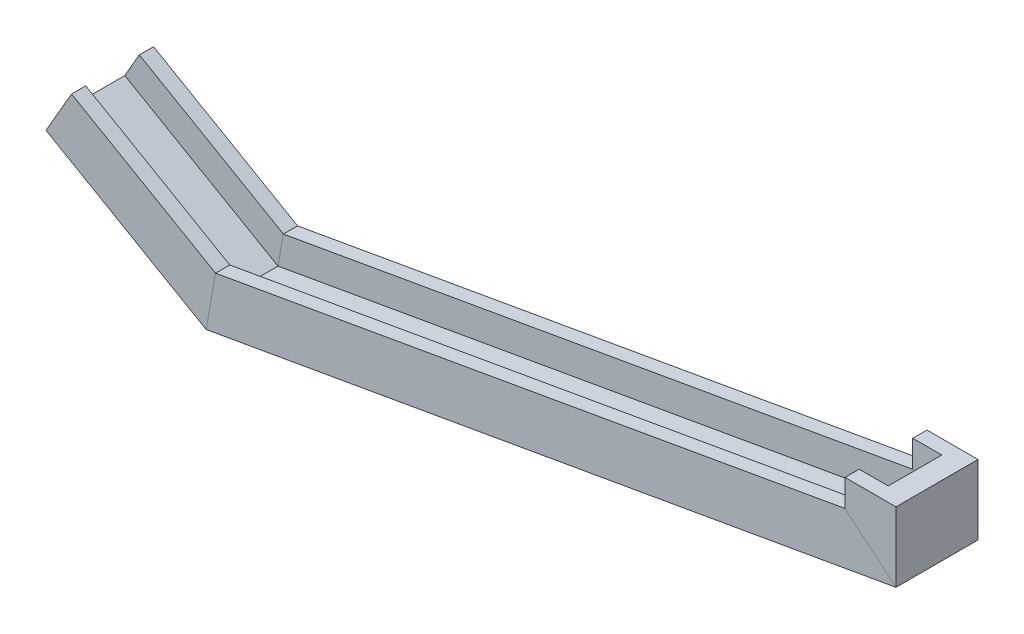
ISO-10303-21;
HEADER;
FILE_DESCRIPTION(('STEP AP214'),'2;1');
FILE_NAME('part.step','',(''),(''),'','','');
FILE_SCHEMA(('AUTOMOTIVE_DESIGN { 1 0 10303 214 1 1 1 1 }'));
ENDSEC;
DATA;
#1=APPLICATION_CONTEXT('core data for automotive mechanical design processes');
#2=APPLICATION_PROTOCOL_DEFINITION('international standard','automotive_design',2000,#1);
#3=PRODUCT_CONTEXT('',#1,'mechanical');
#4=PRODUCT('Part','Part','',(#3));
#5=PRODUCT_RELATED_PRODUCT_CATEGORY('part','',(#4));
#6=PRODUCT_DEFINITION_FORMATION('','',#4);
#7=PRODUCT_DEFINITION_CONTEXT('part definition',#1,'design');
#8=PRODUCT_DEFINITION('design','',#6,#7);
#9=PRODUCT_DEFINITION_SHAPE('','',#8);
#10=(LENGTH_UNIT() NAMED_UNIT(*) SI_UNIT(.MILLI.,.METRE.));
#11=(NAMED_UNIT(*) PLANE_ANGLE_UNIT() SI_UNIT($,.RADIAN.));
#12=(NAMED_UNIT(*) SI_UNIT($,.STERADIAN.) SOLID_ANGLE_UNIT());
#13=UNCERTAINTY_MEASURE_WITH_UNIT(LENGTH_MEASURE(1.E-05),#10,'distance_accuracy_value','');
#14=(GEOMETRIC_REPRESENTATION_CONTEXT(3) GLOBAL_UNCERTAINTY_ASSIGNED_CONTEXT((#13)) GLOBAL_UNIT_ASSIGNED_CONTEXT((#10,
#11,#12)) REPRESENTATION_CONTEXT('',''));
#15=CARTESIAN_POINT('',(0.,0.,0.));
#16=DIRECTION('',(0.,0.,1.));
#17=DIRECTION('',(1.,0.,0.));
#18=AXIS2_PLACEMENT_3D('',#15,#16,#17);
#19=CARTESIAN_POINT('',(-188.040030525231,-31.7909185882383,0.));
#20=DIRECTION('',(0.866025403784436,-0.500000000000005,0.));
#21=DIRECTION('',(0.,0.,1.));
#22=AXIS2_PLACEMENT_3D('',#19,#20,#21);
#23=PLANE('',#22);
#24=DIRECTION('',(0.500000000000005,0.866025403784436,0.));
#25=VECTOR('',#24,1.);
#26=CARTESIAN_POINT('',(-175.873309957385,-10.7175404032353,-24.3031703208653));
#27=LINE('',#26,#25);
#28=CARTESIAN_POINT('',(-180.873309957385,-19.3777944410797,-24.3031703208653));
#29=VERTEX_POINT('',#28);
#30=CARTESIAN_POINT('',(-175.873309957385,-10.7175404032353,-24.3031703208653));
#31=VERTEX_POINT('',#30);
#32=EDGE_CURVE('E127',#29,#31,#27,.T.);
#33=ORIENTED_EDGE('',*,*,#32,.F.);
#34=DIRECTION('',(0.,0.,-1.));
#35=VECTOR('',#34,1.);
#36=CARTESIAN_POINT('',(-180.873309957385,-19.3777944410797,-8.23317032086531));
#37=LINE('',#36,#35);
#38=CARTESIAN_POINT('',(-180.873309957385,-19.3777944410797,-8.23317032086531));
#39=VERTEX_POINT('',#38);
#40=EDGE_CURVE('E181',#39,#29,#37,.T.);
#41=ORIENTED_EDGE('',*,*,#40,.F.);
#42=DIRECTION('',(-0.500000000000005,-0.866025403784436,0.));
#43=VECTOR('',#42,1.);
#44=CARTESIAN_POINT('',(-175.873309957385,-10.7175404032353,-8.23317032086531));
#45=LINE('',#44,#43);
#46=CARTESIAN_POINT('',(-175.873309957385,-10.7175404032353,-8.23317032086531));
#47=VERTEX_POINT('',#46);
#48=EDGE_CURVE('E178',#47,#39,#45,.T.);
#49=ORIENTED_EDGE('',*,*,#48,.F.);
#50=DIRECTION('',(0.,0.,1.));
#51=VECTOR('',#50,1.);
#52=CARTESIAN_POINT('',(-175.873309957385,-10.7175404032353,-11.0181703208653));
#53=LINE('',#52,#51);
#54=CARTESIAN_POINT('',(-175.873309957385,-10.7175404032353,-11.0181703208653));
#55=VERTEX_POINT('',#54);
#56=EDGE_CURVE('E175',#55,#47,#53,.T.);
#57=ORIENTED_EDGE('',*,*,#56,.F.);
#58=DIRECTION('',(0.500000000000005,0.866025403784436,0.));
#59=VECTOR('',#58,1.);
#60=CARTESIAN_POINT('',(-178.71986344873,-15.6479156767077,-11.0181703208653));
#61=LINE('',#60,#59);
#62=CARTESIAN_POINT('',(-178.71986344873,-15.6479156767077,-11.0181703208653));
#63=VERTEX_POINT('',#62);
#64=EDGE_CURVE('E172',#63,#55,#61,.T.);
#65=ORIENTED_EDGE('',*,*,#64,.F.);
#66=DIRECTION('',(0.,0.,1.));
#67=VECTOR('',#66,1.);
#68=CARTESIAN_POINT('',(-178.71986344873,-15.6479156767077,-21.5181703208653));
#69=LINE('',#68,#67);
#70=CARTESIAN_POINT('',(-178.71986344873,-15.6479156767077,-21.5181703208653));
#71=VERTEX_POINT('',#70);
#72=EDGE_CURVE('E130',#71,#63,#69,.T.);
#73=ORIENTED_EDGE('',*,*,#72,.F.);
#74=DIRECTION('',(-0.500000000000005,-0.866025403784436,0.));
#75=VECTOR('',#74,1.);
#76=CARTESIAN_POINT('',(-175.873309957385,-10.7175404032353,-21.5181703208653));
#77=LINE('',#76,#75);
#78=CARTESIAN_POINT('',(-175.873309957385,-10.7175404032353,-21.5181703208653));
#79=VERTEX_POINT('',#78);
#80=EDGE_CURVE('E111',#79,#71,#77,.T.);
#81=ORIENTED_EDGE('',*,*,#80,.F.);
#82=DIRECTION('',(0.,0.,1.));
#83=VECTOR('',#82,1.);
#84=CARTESIAN_POINT('',(-175.873309957385,-10.7175404032353,-21.5181703208653));
#85=LINE('',#84,#83);
#86=EDGE_CURVE('E118',#31,#79,#85,.T.);
#87=ORIENTED_EDGE('',*,*,#86,.F.);
#88=EDGE_LOOP('',(#33,#41,#49,#57,#65,#73,#81,#87));
#89=FACE_BOUND('',#88,.T.);
#90=ADVANCED_FACE('F39',(#89),#23,.F.);
#91=CARTESIAN_POINT('',(0.,0.,0.));
#92=DIRECTION('',(0.,1.,0.));
#93=DIRECTION('',(0.,0.,1.));
#94=AXIS2_PLACEMENT_3D('',#91,#92,#93);
#95=PLANE('',#94);
#96=DIRECTION('',(-1.,0.,0.));
#97=VECTOR('',#96,1.);
#98=CARTESIAN_POINT('',(-24.3334411356926,0.,-24.3031703208653));
#99=LINE('',#98,#97);
#100=CARTESIAN_POINT('',(-14.3334411356926,0.,-24.3031703208653));
#101=VERTEX_POINT('',#100);
#102=CARTESIAN_POINT('',(-24.3334411356926,0.,-24.3031703208653));
#103=VERTEX_POINT('',#102);
#104=EDGE_CURVE('E252',#101,#103,#99,.T.);
#105=ORIENTED_EDGE('',*,*,#104,.T.);
#106=DIRECTION('',(0.,0.,1.));
#107=VECTOR('',#106,1.);
#108=CARTESIAN_POINT('',(-24.3334411356926,0.,-21.5181703208653));
#109=LINE('',#108,#107);
#110=CARTESIAN_POINT('',(-24.3334411356926,0.,-21.5181703208653));
#111=VERTEX_POINT('',#110);
#112=EDGE_CURVE('E247',#103,#111,#109,.T.);
#113=ORIENTED_EDGE('',*,*,#112,.T.);
#114=DIRECTION('',(1.,0.,0.));
#115=VECTOR('',#114,1.);
#116=CARTESIAN_POINT('',(-24.3334411356926,0.,-21.5181703208653));
#117=LINE('',#116,#115);
#118=CARTESIAN_POINT('',(-18.6403341530022,0.,-21.5181703208653));
#119=VERTEX_POINT('',#118);
#120=EDGE_CURVE('E240',#111,#119,#117,.T.);
#121=ORIENTED_EDGE('',*,*,#120,.T.);
#122=DIRECTION('',(0.,0.,1.));
#123=VECTOR('',#122,1.);
#124=CARTESIAN_POINT('',(-18.6403341530022,0.,-21.5181703208653));
#125=LINE('',#124,#123);
#126=CARTESIAN_POINT('',(-18.6403341530022,0.,-11.0181703208653));
#127=VERTEX_POINT('',#126);
#128=EDGE_CURVE('E292',#119,#127,#125,.T.);
#129=ORIENTED_EDGE('',*,*,#128,.T.);
#130=DIRECTION('',(-1.,0.,0.));
#131=VECTOR('',#130,1.);
#132=CARTESIAN_POINT('',(-18.6403341530022,0.,-11.0181703208653));
#133=LINE('',#132,#131);
#134=CARTESIAN_POINT('',(-24.3334411356926,0.,-11.0181703208653));
#135=VERTEX_POINT('',#134);
#136=EDGE_CURVE('E284',#127,#135,#133,.T.);
#137=ORIENTED_EDGE('',*,*,#136,.T.);
#138=DIRECTION('',(0.,0.,1.));
#139=VECTOR('',#138,1.);
#140=CARTESIAN_POINT('',(-24.3334411356926,0.,-11.0181703208653));
#141=LINE('',#140,#139);
#142=CARTESIAN_POINT('',(-24.3334411356926,0.,-8.23317032086531));
#143=VERTEX_POINT('',#142);
#144=EDGE_CURVE('E276',#135,#143,#141,.T.);
#145=ORIENTED_EDGE('',*,*,#144,.T.);
#146=DIRECTION('',(1.,0.,0.));
#147=VECTOR('',#146,1.);
#148=CARTESIAN_POINT('',(-24.3334411356926,0.,-8.23317032086531));
#149=LINE('',#148,#147);
#150=CARTESIAN_POINT('',(-14.3334411356926,0.,-8.23317032086531));
#151=VERTEX_POINT('',#150);
#152=EDGE_CURVE('E268',#143,#151,#149,.T.);
#153=ORIENTED_EDGE('',*,*,#152,.T.);
#154=DIRECTION('',(0.,0.,-1.));
#155=VECTOR('',#154,1.);
#156=CARTESIAN_POINT('',(-14.3334411356926,0.,-8.23317032086531));
#157=LINE('',#156,#155);
#158=EDGE_CURVE('E260',#151,#101,#157,.T.);
#159=ORIENTED_EDGE('',*,*,#158,.T.);
#160=EDGE_LOOP('',(#105,#113,#121,#129,#137,#145,#153,#159));
#161=FACE_BOUND('',#160,.T.);
#162=ADVANCED_FACE('F388',(#161),#95,.T.);
#163=CARTESIAN_POINT('',(-144.275002717369,-28.9608315941949,-21.5181703208653));
#164=DIRECTION('',(0.,0.,-1.));
#165=DIRECTION('',(-1.,0.,0.));
#166=AXIS2_PLACEMENT_3D('',#163,#164,#165);
#167=PLANE('',#166);
#168=DIRECTION('',(0.173648177666935,0.984807753012207,0.));
#169=VECTOR('',#168,1.);
#170=CARTESIAN_POINT('',(-139.688124452556,18.14868532677,-21.5181703208653));
#171=LINE('',#170,#169);
#172=CARTESIAN_POINT('',(-148.703151296713,-32.9780725178624,-21.5181703208653));
#173=VERTEX_POINT('',#172);
#174=CARTESIAN_POINT('',(-147.651107648674,-27.0116365032938,-21.5181703208653));
#175=VERTEX_POINT('',#174);
#176=EDGE_CURVE('E135',#173,#175,#171,.T.);
#177=ORIENTED_EDGE('',*,*,#176,.T.);
#178=DIRECTION('',(-0.866025403784436,0.500000000000005,0.));
#179=VECTOR('',#178,1.);
#180=CARTESIAN_POINT('',(-144.275002717369,-28.9608315941949,-21.5181703208653));
#181=LINE('',#180,#179);
#182=EDGE_CURVE('E42',#175,#79,#181,.T.);
#183=ORIENTED_EDGE('',*,*,#182,.T.);
#184=ORIENTED_EDGE('',*,*,#80,.T.);
#185=DIRECTION('',(-0.866025403784436,0.500000000000005,0.));
#186=VECTOR('',#185,1.);
#187=CARTESIAN_POINT('',(-147.121556208715,-33.8912068676673,-21.5181703208653));
#188=LINE('',#187,#186);
#189=EDGE_CURVE('E139',#173,#71,#188,.T.);
#190=ORIENTED_EDGE('',*,*,#189,.F.);
#191=EDGE_LOOP('',(#177,#183,#184,#190));
#192=FACE_BOUND('',#191,.T.);
#193=ADVANCED_FACE('F134',(#192),#167,.F.);
#194=CARTESIAN_POINT('',(-147.121556208715,-33.8912068676673,-21.5181703208653));
#195=DIRECTION('',(-0.500000000000005,-0.866025403784436,0.));
#196=DIRECTION('',(0.866025403784436,-0.500000000000005,0.));
#197=AXIS2_PLACEMENT_3D('',#194,#195,#196);
#198=PLANE('',#197);
#199=DIRECTION('',(0.,0.,-1.));
#200=VECTOR('',#199,1.);
#201=CARTESIAN_POINT('',(-148.703151296713,-32.9780725178624,-21.5181703208653));
#202=LINE('',#201,#200);
#203=CARTESIAN_POINT('',(-148.703151296713,-32.9780725178624,-11.0181703208653));
#204=VERTEX_POINT('',#203);
#205=EDGE_CURVE('E237',#204,#173,#202,.T.);
#206=ORIENTED_EDGE('',*,*,#205,.T.);
#207=ORIENTED_EDGE('',*,*,#189,.T.);
#208=ORIENTED_EDGE('',*,*,#72,.T.);
#209=DIRECTION('',(-0.866025403784436,0.500000000000005,0.));
#210=VECTOR('',#209,1.);
#211=CARTESIAN_POINT('',(-147.121556208715,-33.8912068676673,-11.0181703208653));
#212=LINE('',#211,#210);
#213=EDGE_CURVE('E145',#204,#63,#212,.T.);
#214=ORIENTED_EDGE('',*,*,#213,.F.);
#215=EDGE_LOOP('',(#206,#207,#208,#214));
#216=FACE_BOUND('',#215,.T.);
#217=ADVANCED_FACE('F400',(#216),#198,.F.);
#218=CARTESIAN_POINT('',(-147.121556208715,-33.8912068676673,-11.0181703208653));
#219=DIRECTION('',(0.,0.,1.));
#220=DIRECTION('',(1.,0.,0.));
#221=AXIS2_PLACEMENT_3D('',#218,#219,#220);
#222=PLANE('',#221);
#223=DIRECTION('',(-0.173648177666935,-0.984807753012207,0.));
#224=VECTOR('',#223,1.);
#225=CARTESIAN_POINT('',(-140.617102371825,12.8801897423931,-11.0181703208653));
#226=LINE('',#225,#224);
#227=CARTESIAN_POINT('',(-147.651107648674,-27.0116365032938,-11.0181703208653));
#228=VERTEX_POINT('',#227);
#229=EDGE_CURVE('E233',#228,#204,#226,.T.);
#230=ORIENTED_EDGE('',*,*,#229,.T.);
#231=ORIENTED_EDGE('',*,*,#213,.T.);
#232=ORIENTED_EDGE('',*,*,#64,.T.);
#233=DIRECTION('',(-0.866025403784436,0.500000000000005,0.));
#234=VECTOR('',#233,1.);
#235=CARTESIAN_POINT('',(-144.275002717369,-28.9608315941949,-11.0181703208653));
#236=LINE('',#235,#234);
#237=EDGE_CURVE('E150',#228,#55,#236,.T.);
#238=ORIENTED_EDGE('',*,*,#237,.F.);
#239=EDGE_LOOP('',(#230,#231,#232,#238));
#240=FACE_BOUND('',#239,.T.);
#241=ADVANCED_FACE('F403',(#240),#222,.F.);
#242=CARTESIAN_POINT('',(-144.275002717369,-28.9608315941949,-11.0181703208653));
#243=DIRECTION('',(-0.500000000000005,-0.866025403784436,0.));
#244=DIRECTION('',(0.866025403784436,-0.500000000000005,0.));
#245=AXIS2_PLACEMENT_3D('',#242,#243,#244);
#246=PLANE('',#245);
#247=DIRECTION('',(0.,0.,-1.));
#248=VECTOR('',#247,1.);
#249=CARTESIAN_POINT('',(-147.651107648674,-27.0116365032938,-11.0181703208653));
#250=LINE('',#249,#248);
#251=CARTESIAN_POINT('',(-147.651107648674,-27.0116365032938,-8.23317032086531));
#252=VERTEX_POINT('',#251);
#253=EDGE_CURVE('E229',#252,#228,#250,.T.);
#254=ORIENTED_EDGE('',*,*,#253,.T.);
#255=ORIENTED_EDGE('',*,*,#237,.T.);
#256=ORIENTED_EDGE('',*,*,#56,.T.);
#257=DIRECTION('',(-0.866025403784436,0.500000000000005,0.));
#258=VECTOR('',#257,1.);
#259=CARTESIAN_POINT('',(-144.275002717369,-28.9608315941949,-8.23317032086531));
#260=LINE('',#259,#258);
#261=EDGE_CURVE('E156',#252,#47,#260,.T.);
#262=ORIENTED_EDGE('',*,*,#261,.F.);
#263=EDGE_LOOP('',(#254,#255,#256,#262));
#264=FACE_BOUND('',#263,.T.);
#265=ADVANCED_FACE('F406',(#264),#246,.F.);
#266=CARTESIAN_POINT('',(-144.275002717369,-28.9608315941949,-8.23317032086531));
#267=DIRECTION('',(0.,0.,-1.));
#268=DIRECTION('',(-1.,0.,0.));
#269=AXIS2_PLACEMENT_3D('',#266,#267,#268);
#270=PLANE('',#269);
#271=DIRECTION('',(0.173648177666935,0.984807753012207,0.));
#272=VECTOR('',#271,1.);
#273=CARTESIAN_POINT('',(-139.688124452556,18.14868532677,-8.23317032086531));
#274=LINE('',#273,#272);
#275=CARTESIAN_POINT('',(-149.499032957715,-37.4917417124692,-8.23317032086531));
#276=VERTEX_POINT('',#275);
#277=EDGE_CURVE('E225',#276,#252,#274,.T.);
#278=ORIENTED_EDGE('',*,*,#277,.T.);
#279=ORIENTED_EDGE('',*,*,#261,.T.);
#280=ORIENTED_EDGE('',*,*,#48,.T.);
#281=DIRECTION('',(-0.866025403784436,0.500000000000005,0.));
#282=VECTOR('',#281,1.);
#283=CARTESIAN_POINT('',(-149.275002717369,-37.6210856320393,-8.23317032086531));
#284=LINE('',#283,#282);
#285=EDGE_CURVE('E160',#276,#39,#284,.T.);
#286=ORIENTED_EDGE('',*,*,#285,.F.);
#287=EDGE_LOOP('',(#278,#279,#280,#286));
#288=FACE_BOUND('',#287,.T.);
#289=ADVANCED_FACE('F410',(#288),#270,.F.);
#290=CARTESIAN_POINT('',(-149.275002717369,-37.6210856320393,-8.23317032086531));
#291=DIRECTION('',(0.500000000000005,0.866025403784436,0.));
#292=DIRECTION('',(-0.866025403784436,0.500000000000005,0.));
#293=AXIS2_PLACEMENT_3D('',#290,#291,#292);
#294=PLANE('',#293);
#295=DIRECTION('',(0.,0.,1.));
#296=VECTOR('',#295,1.);
#297=CARTESIAN_POINT('',(-149.499032957715,-37.4917417124692,-8.23317032086531));
#298=LINE('',#297,#296);
#299=CARTESIAN_POINT('',(-149.499032957715,-37.4917417124692,-24.3031703208653));
#300=VERTEX_POINT('',#299);
#301=EDGE_CURVE('E221',#300,#276,#298,.T.);
#302=ORIENTED_EDGE('',*,*,#301,.T.);
#303=ORIENTED_EDGE('',*,*,#285,.T.);
#304=ORIENTED_EDGE('',*,*,#40,.T.);
#305=DIRECTION('',(-0.866025403784436,0.500000000000005,0.));
#306=VECTOR('',#305,1.);
#307=CARTESIAN_POINT('',(-149.275002717369,-37.6210856320393,-24.3031703208653));
#308=LINE('',#307,#306);
#309=EDGE_CURVE('E164',#300,#29,#308,.T.);
#310=ORIENTED_EDGE('',*,*,#309,.F.);
#311=EDGE_LOOP('',(#302,#303,#304,#310));
#312=FACE_BOUND('',#311,.T.);
#313=ADVANCED_FACE('F414',(#312),#294,.F.);
#314=CARTESIAN_POINT('',(-144.275002717369,-28.9608315941949,-24.3031703208653));
#315=DIRECTION('',(0.,0.,1.));
#316=DIRECTION('',(1.,0.,0.));
#317=AXIS2_PLACEMENT_3D('',#314,#315,#316);
#318=PLANE('',#317);
#319=DIRECTION('',(-0.173648177666935,-0.984807753012207,0.));
#320=VECTOR('',#319,1.);
#321=CARTESIAN_POINT('',(-139.688124452556,18.14868532677,-24.3031703208653));
#322=LINE('',#321,#320);
#323=CARTESIAN_POINT('',(-147.651107648674,-27.0116365032938,-24.3031703208653));
#324=VERTEX_POINT('',#323);
#325=EDGE_CURVE('E217',#324,#300,#322,.T.);
#326=ORIENTED_EDGE('',*,*,#325,.T.);
#327=ORIENTED_EDGE('',*,*,#309,.T.);
#328=ORIENTED_EDGE('',*,*,#32,.T.);
#329=DIRECTION('',(-0.866025403784436,0.500000000000005,0.));
#330=VECTOR('',#329,1.);
#331=CARTESIAN_POINT('',(-144.275002717369,-28.9608315941949,-24.3031703208653));
#332=LINE('',#331,#330);
#333=EDGE_CURVE('E123',#324,#31,#332,.T.);
#334=ORIENTED_EDGE('',*,*,#333,.F.);
#335=EDGE_LOOP('',(#326,#327,#328,#334));
#336=FACE_BOUND('',#335,.T.);
#337=ADVANCED_FACE('F433',(#336),#318,.F.);
#338=CARTESIAN_POINT('',(-144.275002717369,-28.9608315941949,-21.5181703208653));
#339=DIRECTION('',(-0.500000000000005,-0.866025403784436,0.));
#340=DIRECTION('',(0.866025403784436,-0.500000000000005,0.));
#341=AXIS2_PLACEMENT_3D('',#338,#339,#340);
#342=PLANE('',#341);
#343=DIRECTION('',(0.,0.,-1.));
#344=VECTOR('',#343,1.);
#345=CARTESIAN_POINT('',(-147.651107648674,-27.0116365032938,-21.5181703208653));
#346=LINE('',#345,#344);
#347=EDGE_CURVE('E188',#175,#324,#346,.T.);
#348=ORIENTED_EDGE('',*,*,#347,.T.);
#349=ORIENTED_EDGE('',*,*,#333,.T.);
#350=ORIENTED_EDGE('',*,*,#86,.T.);
#351=ORIENTED_EDGE('',*,*,#182,.F.);
#352=EDGE_LOOP('',(#348,#349,#350,#351));
#353=FACE_BOUND('',#352,.T.);
#354=ADVANCED_FACE('F120',(#353),#342,.F.);
#355=CARTESIAN_POINT('',(-15.6111599691523,-3.72943119606066,-21.5181703208653));
#356=DIRECTION('',(0.173648177666926,-0.984807753012209,0.));
#357=DIRECTION('',(0.984807753012209,0.173648177666926,0.));
#358=AXIS2_PLACEMENT_3D('',#355,#356,#357);
#359=PLANE('',#358);
#360=DIRECTION('',(-0.984807753012209,-0.173648177666926,0.));
#361=VECTOR('',#360,1.);
#362=CARTESIAN_POINT('',(-15.6111599691523,-3.72943119606066,-21.5181703208653));
#363=LINE('',#362,#361);
#364=CARTESIAN_POINT('',(-24.3334411356926,-5.26740469904697,-21.5181703208653));
#365=VERTEX_POINT('',#364);
#366=EDGE_CURVE('E189',#365,#175,#363,.T.);
#367=ORIENTED_EDGE('',*,*,#366,.F.);
#368=DIRECTION('',(0.,0.,-1.));
#369=VECTOR('',#368,1.);
#370=CARTESIAN_POINT('',(-24.3334411356926,-5.26740469904697,-21.5181703208653));
#371=LINE('',#370,#369);
#372=CARTESIAN_POINT('',(-24.3334411356926,-5.26740469904697,-24.3031703208653));
#373=VERTEX_POINT('',#372);
#374=EDGE_CURVE('E245',#365,#373,#371,.T.);
#375=ORIENTED_EDGE('',*,*,#374,.T.);
#376=DIRECTION('',(-0.984807753012209,-0.173648177666926,0.));
#377=VECTOR('',#376,1.);
#378=CARTESIAN_POINT('',(-15.6111599691523,-3.72943119606066,-24.3031703208653));
#379=LINE('',#378,#377);
#380=EDGE_CURVE('E138',#373,#324,#379,.T.);
#381=ORIENTED_EDGE('',*,*,#380,.T.);
#382=ORIENTED_EDGE('',*,*,#347,.F.);
#383=EDGE_LOOP('',(#367,#375,#381,#382));
#384=FACE_BOUND('',#383,.T.);
#385=ADVANCED_FACE('F429',(#384),#359,.F.);
#386=CARTESIAN_POINT('',(-15.6111599691523,-3.72943119606066,-24.3031703208653));
#387=DIRECTION('',(0.,0.,1.));
#388=DIRECTION('',(1.,0.,0.));
#389=AXIS2_PLACEMENT_3D('',#386,#387,#388);
#390=PLANE('',#389);
#391=ORIENTED_EDGE('',*,*,#380,.F.);
#392=DIRECTION('',(0.766044443118977,-0.642787609686541,0.));
#393=VECTOR('',#392,1.);
#394=CARTESIAN_POINT('',(-26.9271316286298,-3.09103996303534,-24.3031703208653));
#395=LINE('',#394,#393);
#396=CARTESIAN_POINT('',(-14.3334411356926,-13.6584010108198,-24.3031703208653));
#397=VERTEX_POINT('',#396);
#398=EDGE_CURVE('E311',#373,#397,#395,.T.);
#399=ORIENTED_EDGE('',*,*,#398,.T.);
#400=DIRECTION('',(-0.984807753012209,-0.173648177666926,0.));
#401=VECTOR('',#400,1.);
#402=CARTESIAN_POINT('',(-13.874678192483,-13.5775087261827,-24.3031703208653));
#403=LINE('',#402,#401);
#404=EDGE_CURVE('E143',#397,#300,#403,.T.);
#405=ORIENTED_EDGE('',*,*,#404,.T.);
#406=ORIENTED_EDGE('',*,*,#325,.F.);
#407=EDGE_LOOP('',(#391,#399,#405,#406));
#408=FACE_BOUND('',#407,.T.);
#409=ADVANCED_FACE('F431',(#408),#390,.F.);
#410=CARTESIAN_POINT('',(-13.874678192483,-13.5775087261827,-8.23317032086531));
#411=DIRECTION('',(-0.173648177666926,0.984807753012209,0.));
#412=DIRECTION('',(-0.984807753012209,-0.173648177666926,0.));
#413=AXIS2_PLACEMENT_3D('',#410,#411,#412);
#414=PLANE('',#413);
#415=ORIENTED_EDGE('',*,*,#404,.F.);
#416=DIRECTION('',(0.,0.,1.));
#417=VECTOR('',#416,1.);
#418=CARTESIAN_POINT('',(-14.3334411356926,-13.6584010108198,-8.23317032086531));
#419=LINE('',#418,#417);
#420=CARTESIAN_POINT('',(-14.3334411356926,-13.6584010108198,-8.23317032086531));
#421=VERTEX_POINT('',#420);
#422=EDGE_CURVE('E315',#397,#421,#419,.T.);
#423=ORIENTED_EDGE('',*,*,#422,.T.);
#424=DIRECTION('',(-0.984807753012209,-0.173648177666926,0.));
#425=VECTOR('',#424,1.);
#426=CARTESIAN_POINT('',(-13.874678192483,-13.5775087261827,-8.23317032086531));
#427=LINE('',#426,#425);
#428=EDGE_CURVE('E208',#421,#276,#427,.T.);
#429=ORIENTED_EDGE('',*,*,#428,.T.);
#430=ORIENTED_EDGE('',*,*,#301,.F.);
#431=EDGE_LOOP('',(#415,#423,#429,#430));
#432=FACE_BOUND('',#431,.T.);
#433=ADVANCED_FACE('F417',(#432),#414,.F.);
#434=CARTESIAN_POINT('',(-15.6111599691523,-3.72943119606066,-8.23317032086531));
#435=DIRECTION('',(0.,0.,-1.));
#436=DIRECTION('',(-1.,0.,0.));
#437=AXIS2_PLACEMENT_3D('',#434,#435,#436);
#438=PLANE('',#437);
#439=ORIENTED_EDGE('',*,*,#428,.F.);
#440=DIRECTION('',(-0.766044443118977,0.642787609686541,0.));
#441=VECTOR('',#440,1.);
#442=CARTESIAN_POINT('',(-26.9271316286298,-3.09103996303534,-8.23317032086531));
#443=LINE('',#442,#441);
#444=CARTESIAN_POINT('',(-24.3334411356926,-5.26740469904697,-8.23317032086531));
#445=VERTEX_POINT('',#444);
#446=EDGE_CURVE('E319',#421,#445,#443,.T.);
#447=ORIENTED_EDGE('',*,*,#446,.T.);
#448=DIRECTION('',(-0.984807753012209,-0.173648177666926,0.));
#449=VECTOR('',#448,1.);
#450=CARTESIAN_POINT('',(-15.6111599691523,-3.72943119606066,-8.23317032086531));
#451=LINE('',#450,#449);
#452=EDGE_CURVE('E204',#445,#252,#451,.T.);
#453=ORIENTED_EDGE('',*,*,#452,.T.);
#454=ORIENTED_EDGE('',*,*,#277,.F.);
#455=EDGE_LOOP('',(#439,#447,#453,#454));
#456=FACE_BOUND('',#455,.T.);
#457=ADVANCED_FACE('F383',(#456),#438,.F.);
#458=CARTESIAN_POINT('',(-15.6111599691523,-3.72943119606066,-11.0181703208653));
#459=DIRECTION('',(0.173648177666926,-0.984807753012209,0.));
#460=DIRECTION('',(0.984807753012209,0.173648177666926,0.));
#461=AXIS2_PLACEMENT_3D('',#458,#459,#460);
#462=PLANE('',#461);
#463=ORIENTED_EDGE('',*,*,#452,.F.);
#464=DIRECTION('',(0.,0.,-1.));
#465=VECTOR('',#464,1.);
#466=CARTESIAN_POINT('',(-24.3334411356926,-5.26740469904697,-11.0181703208653));
#467=LINE('',#466,#465);
#468=CARTESIAN_POINT('',(-24.3334411356926,-5.26740469904697,-11.0181703208653));
#469=VERTEX_POINT('',#468);
#470=EDGE_CURVE('E323',#445,#469,#467,.T.);
#471=ORIENTED_EDGE('',*,*,#470,.T.);
#472=DIRECTION('',(-0.984807753012209,-0.173648177666926,0.));
#473=VECTOR('',#472,1.);
#474=CARTESIAN_POINT('',(-15.6111599691523,-3.72943119606066,-11.0181703208653));
#475=LINE('',#474,#473);
#476=EDGE_CURVE('E200',#469,#228,#475,.T.);
#477=ORIENTED_EDGE('',*,*,#476,.T.);
#478=ORIENTED_EDGE('',*,*,#253,.F.);
#479=EDGE_LOOP('',(#463,#471,#477,#478));
#480=FACE_BOUND('',#479,.T.);
#481=ADVANCED_FACE('F379',(#480),#462,.F.);
#482=CARTESIAN_POINT('',(-14.6225623163453,-9.33604709134206,-11.0181703208653));
#483=DIRECTION('',(0.,0.,1.));
#484=DIRECTION('',(1.,0.,0.));
#485=AXIS2_PLACEMENT_3D('',#482,#483,#484);
#486=PLANE('',#485);
#487=ORIENTED_EDGE('',*,*,#476,.F.);
#488=DIRECTION('',(0.766044443118977,-0.642787609686541,0.));
#489=VECTOR('',#488,1.);
#490=CARTESIAN_POINT('',(-23.5862793108811,-5.89434791067604,-11.0181703208653));
#491=LINE('',#490,#489);
#492=CARTESIAN_POINT('',(-18.6403341530022,-10.0444886684753,-11.0181703208653));
#493=VERTEX_POINT('',#492);
#494=EDGE_CURVE('E49',#469,#493,#491,.T.);
#495=ORIENTED_EDGE('',*,*,#494,.T.);
#496=DIRECTION('',(-0.984807753012209,-0.173648177666926,0.));
#497=VECTOR('',#496,1.);
#498=CARTESIAN_POINT('',(-14.6225623163453,-9.33604709134206,-11.0181703208653));
#499=LINE('',#498,#497);
#500=EDGE_CURVE('E196',#493,#204,#499,.T.);
#501=ORIENTED_EDGE('',*,*,#500,.T.);
#502=ORIENTED_EDGE('',*,*,#229,.F.);
#503=EDGE_LOOP('',(#487,#495,#501,#502));
#504=FACE_BOUND('',#503,.T.);
#505=ADVANCED_FACE('F331',(#504),#486,.F.);
#506=CARTESIAN_POINT('',(-14.6225623163453,-9.33604709134205,-21.5181703208653));
#507=DIRECTION('',(0.173648177666926,-0.984807753012209,0.));
#508=DIRECTION('',(0.984807753012209,0.173648177666926,0.));
#509=AXIS2_PLACEMENT_3D('',#506,#507,#508);
#510=PLANE('',#509);
#511=ORIENTED_EDGE('',*,*,#500,.F.);
#512=DIRECTION('',(0.,0.,-1.));
#513=VECTOR('',#512,1.);
#514=CARTESIAN_POINT('',(-18.6403341530022,-10.0444886684753,-21.5181703208653));
#515=LINE('',#514,#513);
#516=CARTESIAN_POINT('',(-18.6403341530022,-10.0444886684753,-21.5181703208653));
#517=VERTEX_POINT('',#516);
#518=EDGE_CURVE('E11',#493,#517,#515,.T.);
#519=ORIENTED_EDGE('',*,*,#518,.T.);
#520=DIRECTION('',(-0.984807753012209,-0.173648177666926,0.));
#521=VECTOR('',#520,1.);
#522=CARTESIAN_POINT('',(-14.6225623163453,-9.33604709134205,-21.5181703208653));
#523=LINE('',#522,#521);
#524=EDGE_CURVE('E192',#517,#173,#523,.T.);
#525=ORIENTED_EDGE('',*,*,#524,.T.);
#526=ORIENTED_EDGE('',*,*,#205,.F.);
#527=EDGE_LOOP('',(#511,#519,#525,#526));
#528=FACE_BOUND('',#527,.T.);
#529=ADVANCED_FACE('F398',(#528),#510,.F.);
#530=CARTESIAN_POINT('',(-15.6111599691523,-3.72943119606066,-21.5181703208653));
#531=DIRECTION('',(0.,0.,-1.));
#532=DIRECTION('',(-1.,0.,0.));
#533=AXIS2_PLACEMENT_3D('',#530,#531,#532);
#534=PLANE('',#533);
#535=ORIENTED_EDGE('',*,*,#524,.F.);
#536=DIRECTION('',(-0.766044443118977,0.642787609686541,0.));
#537=VECTOR('',#536,1.);
#538=CARTESIAN_POINT('',(-26.9271316286298,-3.09103996303534,-21.5181703208653));
#539=LINE('',#538,#537);
#540=EDGE_CURVE('E241',#517,#365,#539,.T.);
#541=ORIENTED_EDGE('',*,*,#540,.T.);
#542=ORIENTED_EDGE('',*,*,#366,.T.);
#543=ORIENTED_EDGE('',*,*,#176,.F.);
#544=EDGE_LOOP('',(#535,#541,#542,#543));
#545=FACE_BOUND('',#544,.T.);
#546=ADVANCED_FACE('F396',(#545),#534,.F.);
#547=CARTESIAN_POINT('',(-24.3334411356926,0.,-21.5181703208653));
#548=DIRECTION('',(1.,0.,0.));
#549=DIRECTION('',(0.,0.,-1.));
#550=AXIS2_PLACEMENT_3D('',#547,#548,#549);
#551=PLANE('',#550);
#552=DIRECTION('',(0.,-1.,0.));
#553=VECTOR('',#552,1.);
#554=CARTESIAN_POINT('',(-24.3334411356926,0.,-21.5181703208653));
#555=LINE('',#554,#553);
#556=EDGE_CURVE('E251',#111,#365,#555,.T.);
#557=ORIENTED_EDGE('',*,*,#556,.F.);
#558=ORIENTED_EDGE('',*,*,#112,.F.);
#559=DIRECTION('',(0.,-1.,0.));
#560=VECTOR('',#559,1.);
#561=CARTESIAN_POINT('',(-24.3334411356926,0.,-24.3031703208653));
#562=LINE('',#561,#560);
#563=EDGE_CURVE('E246',#103,#373,#562,.T.);
#564=ORIENTED_EDGE('',*,*,#563,.T.);
#565=ORIENTED_EDGE('',*,*,#374,.F.);
#566=EDGE_LOOP('',(#557,#558,#564,#565));
#567=FACE_BOUND('',#566,.T.);
#568=ADVANCED_FACE('F426',(#567),#551,.F.);
#569=CARTESIAN_POINT('',(-24.3334411356926,0.,-24.3031703208653));
#570=DIRECTION('',(0.,0.,1.));
#571=DIRECTION('',(1.,0.,0.));
#572=AXIS2_PLACEMENT_3D('',#569,#570,#571);
#573=PLANE('',#572);
#574=ORIENTED_EDGE('',*,*,#563,.F.);
#575=ORIENTED_EDGE('',*,*,#104,.F.);
#576=DIRECTION('',(0.,-1.,0.));
#577=VECTOR('',#576,1.);
#578=CARTESIAN_POINT('',(-14.3334411356926,0.,-24.3031703208653));
#579=LINE('',#578,#577);
#580=EDGE_CURVE('E256',#101,#397,#579,.T.);
#581=ORIENTED_EDGE('',*,*,#580,.T.);
#582=ORIENTED_EDGE('',*,*,#398,.F.);
#583=EDGE_LOOP('',(#574,#575,#581,#582));
#584=FACE_BOUND('',#583,.T.);
#585=ADVANCED_FACE('F423',(#584),#573,.F.);
#586=CARTESIAN_POINT('',(-14.3334411356926,0.,-8.23317032086531));
#587=DIRECTION('',(-1.,0.,0.));
#588=DIRECTION('',(0.,0.,1.));
#589=AXIS2_PLACEMENT_3D('',#586,#587,#588);
#590=PLANE('',#589);
#591=ORIENTED_EDGE('',*,*,#580,.F.);
#592=ORIENTED_EDGE('',*,*,#158,.F.);
#593=DIRECTION('',(0.,-1.,0.));
#594=VECTOR('',#593,1.);
#595=CARTESIAN_POINT('',(-14.3334411356926,0.,-8.23317032086531));
#596=LINE('',#595,#594);
#597=EDGE_CURVE('E264',#151,#421,#596,.T.);
#598=ORIENTED_EDGE('',*,*,#597,.T.);
#599=ORIENTED_EDGE('',*,*,#422,.F.);
#600=EDGE_LOOP('',(#591,#592,#598,#599));
#601=FACE_BOUND('',#600,.T.);
#602=ADVANCED_FACE('F420',(#601),#590,.F.);
#603=CARTESIAN_POINT('',(-24.3334411356926,0.,-8.23317032086531));
#604=DIRECTION('',(0.,0.,-1.));
#605=DIRECTION('',(-1.,0.,0.));
#606=AXIS2_PLACEMENT_3D('',#603,#604,#605);
#607=PLANE('',#606);
#608=ORIENTED_EDGE('',*,*,#597,.F.);
#609=ORIENTED_EDGE('',*,*,#152,.F.);
#610=DIRECTION('',(0.,-1.,0.));
#611=VECTOR('',#610,1.);
#612=CARTESIAN_POINT('',(-24.3334411356926,0.,-8.23317032086531));
#613=LINE('',#612,#611);
#614=EDGE_CURVE('E272',#143,#445,#613,.T.);
#615=ORIENTED_EDGE('',*,*,#614,.T.);
#616=ORIENTED_EDGE('',*,*,#446,.F.);
#617=EDGE_LOOP('',(#608,#609,#615,#616));
#618=FACE_BOUND('',#617,.T.);
#619=ADVANCED_FACE('F386',(#618),#607,.F.);
#620=CARTESIAN_POINT('',(-24.3334411356926,0.,-11.0181703208653));
#621=DIRECTION('',(1.,0.,0.));
#622=DIRECTION('',(0.,0.,-1.));
#623=AXIS2_PLACEMENT_3D('',#620,#621,#622);
#624=PLANE('',#623);
#625=ORIENTED_EDGE('',*,*,#614,.F.);
#626=ORIENTED_EDGE('',*,*,#144,.F.);
#627=DIRECTION('',(0.,-1.,0.));
#628=VECTOR('',#627,1.);
#629=CARTESIAN_POINT('',(-24.3334411356926,0.,-11.0181703208653));
#630=LINE('',#629,#628);
#631=EDGE_CURVE('E280',#135,#469,#630,.T.);
#632=ORIENTED_EDGE('',*,*,#631,.T.);
#633=ORIENTED_EDGE('',*,*,#470,.F.);
#634=EDGE_LOOP('',(#625,#626,#632,#633));
#635=FACE_BOUND('',#634,.T.);
#636=ADVANCED_FACE('F377',(#635),#624,.F.);
#637=CARTESIAN_POINT('',(-18.6403341530022,0.,-11.0181703208653));
#638=DIRECTION('',(0.,0.,1.));
#639=DIRECTION('',(1.,0.,0.));
#640=AXIS2_PLACEMENT_3D('',#637,#638,#639);
#641=PLANE('',#640);
#642=ORIENTED_EDGE('',*,*,#631,.F.);
#643=ORIENTED_EDGE('',*,*,#136,.F.);
#644=DIRECTION('',(0.,-1.,0.));
#645=VECTOR('',#644,1.);
#646=CARTESIAN_POINT('',(-18.6403341530022,0.,-11.0181703208653));
#647=LINE('',#646,#645);
#648=EDGE_CURVE('E288',#127,#493,#647,.T.);
#649=ORIENTED_EDGE('',*,*,#648,.T.);
#650=ORIENTED_EDGE('',*,*,#494,.F.);
#651=EDGE_LOOP('',(#642,#643,#649,#650));
#652=FACE_BOUND('',#651,.T.);
#653=ADVANCED_FACE('F335',(#652),#641,.F.);
#654=CARTESIAN_POINT('',(-18.6403341530022,0.,-21.5181703208653));
#655=DIRECTION('',(1.,0.,0.));
#656=DIRECTION('',(0.,0.,-1.));
#657=AXIS2_PLACEMENT_3D('',#654,#655,#656);
#658=PLANE('',#657);
#659=ORIENTED_EDGE('',*,*,#648,.F.);
#660=ORIENTED_EDGE('',*,*,#128,.F.);
#661=DIRECTION('',(0.,-1.,0.));
#662=VECTOR('',#661,1.);
#663=CARTESIAN_POINT('',(-18.6403341530022,0.,-21.5181703208653));
#664=LINE('',#663,#662);
#665=EDGE_CURVE('E296',#119,#517,#664,.T.);
#666=ORIENTED_EDGE('',*,*,#665,.T.);
#667=ORIENTED_EDGE('',*,*,#518,.F.);
#668=EDGE_LOOP('',(#659,#660,#666,#667));
#669=FACE_BOUND('',#668,.T.);
#670=ADVANCED_FACE('F338',(#669),#658,.F.);
#671=CARTESIAN_POINT('',(-24.3334411356926,0.,-21.5181703208653));
#672=DIRECTION('',(0.,0.,-1.));
#673=DIRECTION('',(-1.,0.,0.));
#674=AXIS2_PLACEMENT_3D('',#671,#672,#673);
#675=PLANE('',#674);
#676=ORIENTED_EDGE('',*,*,#665,.F.);
#677=ORIENTED_EDGE('',*,*,#120,.F.);
#678=ORIENTED_EDGE('',*,*,#556,.T.);
#679=ORIENTED_EDGE('',*,*,#540,.F.);
#680=EDGE_LOOP('',(#676,#677,#678,#679));
#681=FACE_BOUND('',#680,.T.);
#682=ADVANCED_FACE('F393',(#681),#675,.F.);
#683=CLOSED_SHELL('',(#90,#162,#193,#217,#241,#265,#289,#313,#337,#354,#385,#409,#433,#457,#481,
#505,#529,#546,#568,#585,#602,#619,#636,#653,#670,#682));
#684=MANIFOLD_SOLID_BREP('B2',#683);
#685=ADVANCED_BREP_SHAPE_REPRESENTATION('',(#18,#684),#14);
#686=SHAPE_DEFINITION_REPRESENTATION(#9,#685);
ENDSEC;
END-ISO-10303-21;
